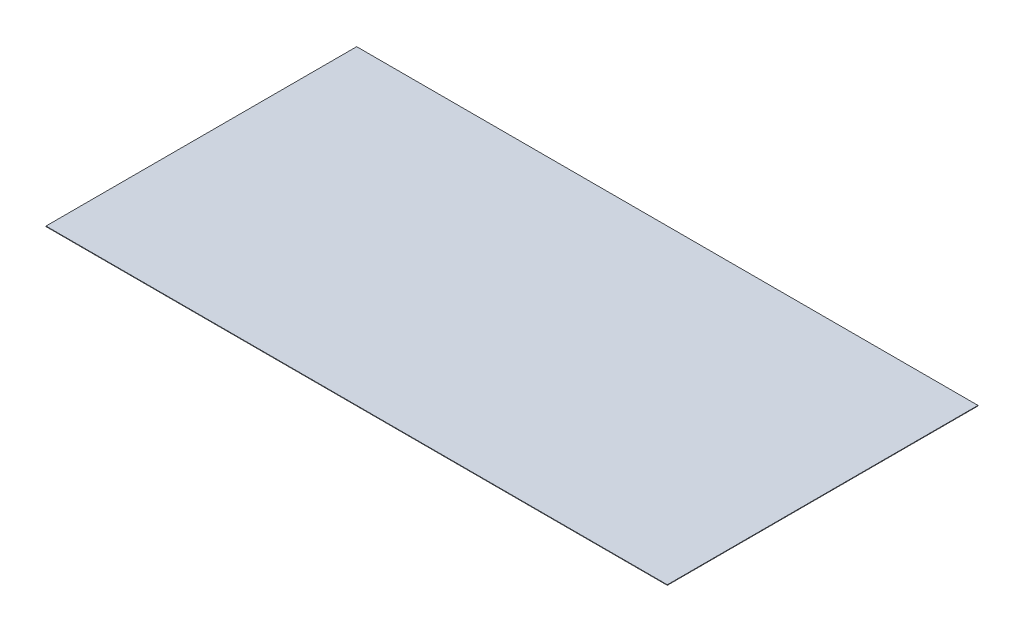
ISO-10303-21;
HEADER;
FILE_DESCRIPTION(('STEP AP214'),'2;1');
FILE_NAME('part.step','',(''),(''),'','','');
FILE_SCHEMA(('AUTOMOTIVE_DESIGN { 1 0 10303 214 1 1 1 1 }'));
ENDSEC;
DATA;
#1=APPLICATION_CONTEXT('core data for automotive mechanical design processes');
#2=APPLICATION_PROTOCOL_DEFINITION('international standard','automotive_design',2000,#1);
#3=PRODUCT_CONTEXT('',#1,'mechanical');
#4=PRODUCT('Part','Part','',(#3));
#5=PRODUCT_RELATED_PRODUCT_CATEGORY('part','',(#4));
#6=PRODUCT_DEFINITION_FORMATION('','',#4);
#7=PRODUCT_DEFINITION_CONTEXT('part definition',#1,'design');
#8=PRODUCT_DEFINITION('design','',#6,#7);
#9=PRODUCT_DEFINITION_SHAPE('','',#8);
#10=(LENGTH_UNIT() NAMED_UNIT(*) SI_UNIT(.MILLI.,.METRE.));
#11=(NAMED_UNIT(*) PLANE_ANGLE_UNIT() SI_UNIT($,.RADIAN.));
#12=(NAMED_UNIT(*) SI_UNIT($,.STERADIAN.) SOLID_ANGLE_UNIT());
#13=UNCERTAINTY_MEASURE_WITH_UNIT(LENGTH_MEASURE(1.E-05),#10,'distance_accuracy_value','');
#14=(GEOMETRIC_REPRESENTATION_CONTEXT(3) GLOBAL_UNCERTAINTY_ASSIGNED_CONTEXT((#13)) GLOBAL_UNIT_ASSIGNED_CONTEXT((#10,
#11,#12)) REPRESENTATION_CONTEXT('',''));
#15=CARTESIAN_POINT('',(0.,0.,0.));
#16=DIRECTION('',(0.,0.,1.));
#17=DIRECTION('',(1.,0.,0.));
#18=AXIS2_PLACEMENT_3D('',#15,#16,#17);
#19=CARTESIAN_POINT('',(3044.,5.,-1522.));
#20=DIRECTION('',(-1.,0.,0.));
#21=DIRECTION('',(0.,0.,1.));
#22=AXIS2_PLACEMENT_3D('',#19,#20,#21);
#23=PLANE('',#22);
#24=DIRECTION('',(0.,0.,-1.));
#25=VECTOR('',#24,1.);
#26=CARTESIAN_POINT('',(3044.,0.,-1522.));
#27=LINE('',#26,#25);
#28=CARTESIAN_POINT('',(3044.,0.,1522.));
#29=VERTEX_POINT('',#28);
#30=CARTESIAN_POINT('',(3044.,0.,-1522.));
#31=VERTEX_POINT('',#30);
#32=EDGE_CURVE('E111',#29,#31,#27,.T.);
#33=ORIENTED_EDGE('',*,*,#32,.T.);
#34=DIRECTION('',(0.,-1.,0.));
#35=VECTOR('',#34,1.);
#36=CARTESIAN_POINT('',(3044.,5.,-1522.));
#37=LINE('',#36,#35);
#38=CARTESIAN_POINT('',(3044.,5.,-1522.));
#39=VERTEX_POINT('',#38);
#40=EDGE_CURVE('E11',#39,#31,#37,.T.);
#41=ORIENTED_EDGE('',*,*,#40,.F.);
#42=DIRECTION('',(0.,0.,-1.));
#43=VECTOR('',#42,1.);
#44=CARTESIAN_POINT('',(3044.,5.,-1522.));
#45=LINE('',#44,#43);
#46=CARTESIAN_POINT('',(3044.,5.,1522.));
#47=VERTEX_POINT('',#46);
#48=EDGE_CURVE('E95',#47,#39,#45,.T.);
#49=ORIENTED_EDGE('',*,*,#48,.F.);
#50=DIRECTION('',(0.,-1.,0.));
#51=VECTOR('',#50,1.);
#52=CARTESIAN_POINT('',(3044.,5.,1522.));
#53=LINE('',#52,#51);
#54=EDGE_CURVE('E107',#47,#29,#53,.T.);
#55=ORIENTED_EDGE('',*,*,#54,.T.);
#56=EDGE_LOOP('',(#33,#41,#49,#55));
#57=FACE_BOUND('',#56,.T.);
#58=ADVANCED_FACE('F43',(#57),#23,.F.);
#59=CARTESIAN_POINT('',(-3044.,5.,-1522.));
#60=DIRECTION('',(0.,0.,1.));
#61=DIRECTION('',(1.,0.,0.));
#62=AXIS2_PLACEMENT_3D('',#59,#60,#61);
#63=PLANE('',#62);
#64=DIRECTION('',(-1.,0.,0.));
#65=VECTOR('',#64,1.);
#66=CARTESIAN_POINT('',(-3044.,0.,-1522.));
#67=LINE('',#66,#65);
#68=CARTESIAN_POINT('',(-3044.,0.,-1522.));
#69=VERTEX_POINT('',#68);
#70=EDGE_CURVE('E100',#31,#69,#67,.T.);
#71=ORIENTED_EDGE('',*,*,#70,.T.);
#72=DIRECTION('',(0.,-1.,0.));
#73=VECTOR('',#72,1.);
#74=CARTESIAN_POINT('',(-3044.,5.,-1522.));
#75=LINE('',#74,#73);
#76=CARTESIAN_POINT('',(-3044.,5.,-1522.));
#77=VERTEX_POINT('',#76);
#78=EDGE_CURVE('E52',#77,#69,#75,.T.);
#79=ORIENTED_EDGE('',*,*,#78,.F.);
#80=DIRECTION('',(-1.,0.,0.));
#81=VECTOR('',#80,1.);
#82=CARTESIAN_POINT('',(-3044.,5.,-1522.));
#83=LINE('',#82,#81);
#84=EDGE_CURVE('E90',#39,#77,#83,.T.);
#85=ORIENTED_EDGE('',*,*,#84,.F.);
#86=ORIENTED_EDGE('',*,*,#40,.T.);
#87=EDGE_LOOP('',(#71,#79,#85,#86));
#88=FACE_BOUND('',#87,.T.);
#89=ADVANCED_FACE('F99',(#88),#63,.F.);
#90=CARTESIAN_POINT('',(-3044.,5.,-1522.));
#91=DIRECTION('',(1.,0.,0.));
#92=DIRECTION('',(0.,0.,-1.));
#93=AXIS2_PLACEMENT_3D('',#90,#91,#92);
#94=PLANE('',#93);
#95=DIRECTION('',(0.,0.,1.));
#96=VECTOR('',#95,1.);
#97=CARTESIAN_POINT('',(-3044.,0.,-1522.));
#98=LINE('',#97,#96);
#99=CARTESIAN_POINT('',(-3044.,0.,1522.));
#100=VERTEX_POINT('',#99);
#101=EDGE_CURVE('E77',#69,#100,#98,.T.);
#102=ORIENTED_EDGE('',*,*,#101,.T.);
#103=DIRECTION('',(0.,-1.,0.));
#104=VECTOR('',#103,1.);
#105=CARTESIAN_POINT('',(-3044.,5.,1522.));
#106=LINE('',#105,#104);
#107=CARTESIAN_POINT('',(-3044.,5.,1522.));
#108=VERTEX_POINT('',#107);
#109=EDGE_CURVE('E102',#108,#100,#106,.T.);
#110=ORIENTED_EDGE('',*,*,#109,.F.);
#111=DIRECTION('',(0.,0.,1.));
#112=VECTOR('',#111,1.);
#113=CARTESIAN_POINT('',(-3044.,5.,-1522.));
#114=LINE('',#113,#112);
#115=EDGE_CURVE('E93',#77,#108,#114,.T.);
#116=ORIENTED_EDGE('',*,*,#115,.F.);
#117=ORIENTED_EDGE('',*,*,#78,.T.);
#118=EDGE_LOOP('',(#102,#110,#116,#117));
#119=FACE_BOUND('',#118,.T.);
#120=ADVANCED_FACE('F103',(#119),#94,.F.);
#121=CARTESIAN_POINT('',(-3044.,5.,1522.));
#122=DIRECTION('',(0.,0.,-1.));
#123=DIRECTION('',(-1.,0.,0.));
#124=AXIS2_PLACEMENT_3D('',#121,#122,#123);
#125=PLANE('',#124);
#126=DIRECTION('',(1.,0.,0.));
#127=VECTOR('',#126,1.);
#128=CARTESIAN_POINT('',(-3044.,0.,1522.));
#129=LINE('',#128,#127);
#130=EDGE_CURVE('E83',#100,#29,#129,.T.);
#131=ORIENTED_EDGE('',*,*,#130,.T.);
#132=ORIENTED_EDGE('',*,*,#54,.F.);
#133=DIRECTION('',(1.,0.,0.));
#134=VECTOR('',#133,1.);
#135=CARTESIAN_POINT('',(-3044.,5.,1522.));
#136=LINE('',#135,#134);
#137=EDGE_CURVE('E60',#108,#47,#136,.T.);
#138=ORIENTED_EDGE('',*,*,#137,.F.);
#139=ORIENTED_EDGE('',*,*,#109,.T.);
#140=EDGE_LOOP('',(#131,#132,#138,#139));
#141=FACE_BOUND('',#140,.T.);
#142=ADVANCED_FACE('F124',(#141),#125,.F.);
#143=CARTESIAN_POINT('',(0.,5.,0.));
#144=DIRECTION('',(0.,1.,0.));
#145=DIRECTION('',(0.,0.,1.));
#146=AXIS2_PLACEMENT_3D('',#143,#144,#145);
#147=PLANE('',#146);
#148=ORIENTED_EDGE('',*,*,#48,.T.);
#149=ORIENTED_EDGE('',*,*,#84,.T.);
#150=ORIENTED_EDGE('',*,*,#115,.T.);
#151=ORIENTED_EDGE('',*,*,#137,.T.);
#152=EDGE_LOOP('',(#148,#149,#150,#151));
#153=FACE_BOUND('',#152,.T.);
#154=ADVANCED_FACE('F91',(#153),#147,.T.);
#155=CARTESIAN_POINT('',(0.,0.,0.));
#156=DIRECTION('',(0.,1.,0.));
#157=DIRECTION('',(0.,0.,1.));
#158=AXIS2_PLACEMENT_3D('',#155,#156,#157);
#159=PLANE('',#158);
#160=ORIENTED_EDGE('',*,*,#32,.F.);
#161=ORIENTED_EDGE('',*,*,#130,.F.);
#162=ORIENTED_EDGE('',*,*,#101,.F.);
#163=ORIENTED_EDGE('',*,*,#70,.F.);
#164=EDGE_LOOP('',(#160,#161,#162,#163));
#165=FACE_BOUND('',#164,.T.);
#166=ADVANCED_FACE('F127',(#165),#159,.F.);
#167=CLOSED_SHELL('',(#58,#89,#120,#142,#154,#166));
#168=MANIFOLD_SOLID_BREP('B2',#167);
#169=ADVANCED_BREP_SHAPE_REPRESENTATION('',(#18,#168),#14);
#170=SHAPE_DEFINITION_REPRESENTATION(#9,#169);
ENDSEC;
END-ISO-10303-21;
